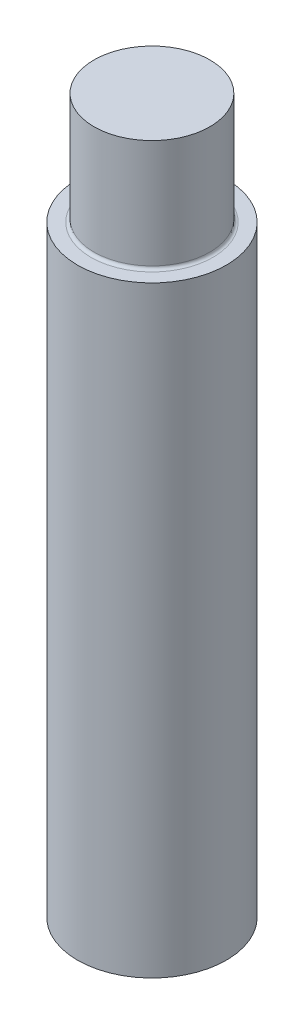
ISO-10303-21;
HEADER;
FILE_DESCRIPTION(('STEP AP214'),'2;1');
FILE_NAME('part.step','',(''),(''),'','','');
FILE_SCHEMA(('AUTOMOTIVE_DESIGN { 1 0 10303 214 1 1 1 1 }'));
ENDSEC;
DATA;
#1=APPLICATION_CONTEXT('core data for automotive mechanical design processes');
#2=APPLICATION_PROTOCOL_DEFINITION('international standard','automotive_design',2000,#1);
#3=PRODUCT_CONTEXT('',#1,'mechanical');
#4=PRODUCT('Part','Part','',(#3));
#5=PRODUCT_RELATED_PRODUCT_CATEGORY('part','',(#4));
#6=PRODUCT_DEFINITION_FORMATION('','',#4);
#7=PRODUCT_DEFINITION_CONTEXT('part definition',#1,'design');
#8=PRODUCT_DEFINITION('design','',#6,#7);
#9=PRODUCT_DEFINITION_SHAPE('','',#8);
#10=(LENGTH_UNIT() NAMED_UNIT(*) SI_UNIT(.MILLI.,.METRE.));
#11=(NAMED_UNIT(*) PLANE_ANGLE_UNIT() SI_UNIT($,.RADIAN.));
#12=(NAMED_UNIT(*) SI_UNIT($,.STERADIAN.) SOLID_ANGLE_UNIT());
#13=UNCERTAINTY_MEASURE_WITH_UNIT(LENGTH_MEASURE(1.E-05),#10,'distance_accuracy_value','');
#14=(GEOMETRIC_REPRESENTATION_CONTEXT(3) GLOBAL_UNCERTAINTY_ASSIGNED_CONTEXT((#13)) GLOBAL_UNIT_ASSIGNED_CONTEXT((#10,
#11,#12)) REPRESENTATION_CONTEXT('',''));
#15=CARTESIAN_POINT('',(0.,0.,0.));
#16=DIRECTION('',(0.,0.,1.));
#17=DIRECTION('',(1.,0.,0.));
#18=AXIS2_PLACEMENT_3D('',#15,#16,#17);
#19=CARTESIAN_POINT('',(0.,98.7,0.));
#20=DIRECTION('',(0.,-1.,0.));
#21=DIRECTION('',(0.,0.,-1.));
#22=AXIS2_PLACEMENT_3D('',#19,#20,#21);
#23=CYLINDRICAL_SURFACE('',#22,12.2);
#24=CARTESIAN_POINT('',(0.,98.7,0.));
#25=DIRECTION('',(0.,1.,0.));
#26=DIRECTION('',(0.,0.,1.));
#27=AXIS2_PLACEMENT_3D('',#24,#25,#26);
#28=CIRCLE('',#27,12.2);
#29=CARTESIAN_POINT('',(0.,98.7,12.2));
#30=VERTEX_POINT('',#29);
#31=EDGE_CURVE('E51',#30,#30,#28,.T.);
#32=ORIENTED_EDGE('',*,*,#31,.F.);
#33=EDGE_LOOP('',(#32));
#34=FACE_BOUND('',#33,.T.);
#35=CARTESIAN_POINT('',(0.,0.,0.));
#36=DIRECTION('',(0.,1.,0.));
#37=DIRECTION('',(0.,0.,1.));
#38=AXIS2_PLACEMENT_3D('',#35,#36,#37);
#39=CIRCLE('',#38,12.2);
#40=CARTESIAN_POINT('',(0.,0.,12.2));
#41=VERTEX_POINT('',#40);
#42=EDGE_CURVE('E55',#41,#41,#39,.T.);
#43=ORIENTED_EDGE('',*,*,#42,.T.);
#44=EDGE_LOOP('',(#43));
#45=FACE_BOUND('',#44,.T.);
#46=ADVANCED_FACE('F40',(#34,#45),#23,.T.);
#47=CARTESIAN_POINT('',(0.,98.7,0.));
#48=DIRECTION('',(0.,1.,0.));
#49=DIRECTION('',(0.,0.,1.));
#50=AXIS2_PLACEMENT_3D('',#47,#48,#49);
#51=PLANE('',#50);
#52=CARTESIAN_POINT('',(0.,98.7,0.));
#53=DIRECTION('',(0.,1.,0.));
#54=DIRECTION('',(0.,0.,1.));
#55=AXIS2_PLACEMENT_3D('',#52,#53,#54);
#56=CIRCLE('',#55,10.);
#57=CARTESIAN_POINT('',(0.,98.7,10.));
#58=VERTEX_POINT('',#57);
#59=EDGE_CURVE('E10',#58,#58,#56,.F.);
#60=ORIENTED_EDGE('',*,*,#59,.T.);
#61=EDGE_LOOP('',(#60));
#62=FACE_BOUND('',#61,.T.);
#63=ORIENTED_EDGE('',*,*,#31,.T.);
#64=EDGE_LOOP('',(#63));
#65=FACE_BOUND('',#64,.T.);
#66=ADVANCED_FACE('F77',(#62,#65),#51,.T.);
#67=CARTESIAN_POINT('',(0.,0.,0.));
#68=DIRECTION('',(0.,1.,0.));
#69=DIRECTION('',(0.,0.,1.));
#70=AXIS2_PLACEMENT_3D('',#67,#68,#69);
#71=PLANE('',#70);
#72=ORIENTED_EDGE('',*,*,#42,.F.);
#73=EDGE_LOOP('',(#72));
#74=FACE_BOUND('',#73,.T.);
#75=ADVANCED_FACE('F68',(#74),#71,.F.);
#76=CARTESIAN_POINT('',(0.,117.,0.));
#77=DIRECTION('',(0.,-1.,0.));
#78=DIRECTION('',(0.,0.,-1.));
#79=AXIS2_PLACEMENT_3D('',#76,#77,#78);
#80=CYLINDRICAL_SURFACE('',#79,9.5);
#81=CARTESIAN_POINT('',(0.,99.2,0.));
#82=DIRECTION('',(0.,1.,0.));
#83=DIRECTION('',(0.,0.,1.));
#84=AXIS2_PLACEMENT_3D('',#81,#82,#83);
#85=CIRCLE('',#84,9.5);
#86=CARTESIAN_POINT('',(0.,99.2,9.5));
#87=VERTEX_POINT('',#86);
#88=EDGE_CURVE('E47',#87,#87,#85,.T.);
#89=ORIENTED_EDGE('',*,*,#88,.T.);
#90=EDGE_LOOP('',(#89));
#91=FACE_BOUND('',#90,.T.);
#92=CARTESIAN_POINT('',(0.,117.,0.));
#93=DIRECTION('',(0.,1.,0.));
#94=DIRECTION('',(0.,0.,1.));
#95=AXIS2_PLACEMENT_3D('',#92,#93,#94);
#96=CIRCLE('',#95,9.5);
#97=CARTESIAN_POINT('',(0.,117.,9.5));
#98=VERTEX_POINT('',#97);
#99=EDGE_CURVE('E59',#98,#98,#96,.T.);
#100=ORIENTED_EDGE('',*,*,#99,.F.);
#101=EDGE_LOOP('',(#100));
#102=FACE_BOUND('',#101,.T.);
#103=ADVANCED_FACE('F66',(#91,#102),#80,.T.);
#104=CARTESIAN_POINT('',(0.,117.,0.));
#105=DIRECTION('',(0.,1.,0.));
#106=DIRECTION('',(0.,0.,1.));
#107=AXIS2_PLACEMENT_3D('',#104,#105,#106);
#108=PLANE('',#107);
#109=ORIENTED_EDGE('',*,*,#99,.T.);
#110=EDGE_LOOP('',(#109));
#111=FACE_BOUND('',#110,.T.);
#112=ADVANCED_FACE('F64',(#111),#108,.T.);
#113=CARTESIAN_POINT('',(0.,99.2,0.));
#114=DIRECTION('',(0.,1.,0.));
#115=DIRECTION('',(0.,0.,1.));
#116=AXIS2_PLACEMENT_3D('',#113,#114,#115);
#117=TOROIDAL_SURFACE('',#116,10.,0.5);
#118=ORIENTED_EDGE('',*,*,#59,.F.);
#119=EDGE_LOOP('',(#118));
#120=FACE_BOUND('',#119,.T.);
#121=ORIENTED_EDGE('',*,*,#88,.F.);
#122=EDGE_LOOP('',(#121));
#123=FACE_BOUND('',#122,.T.);
#124=ADVANCED_FACE('F42',(#120,#123),#117,.F.);
#125=CLOSED_SHELL('',(#46,#66,#75,#103,#112,#124));
#126=MANIFOLD_SOLID_BREP('B2',#125);
#127=ADVANCED_BREP_SHAPE_REPRESENTATION('',(#18,#126),#14);
#128=SHAPE_DEFINITION_REPRESENTATION(#9,#127);
ENDSEC;
END-ISO-10303-21;
